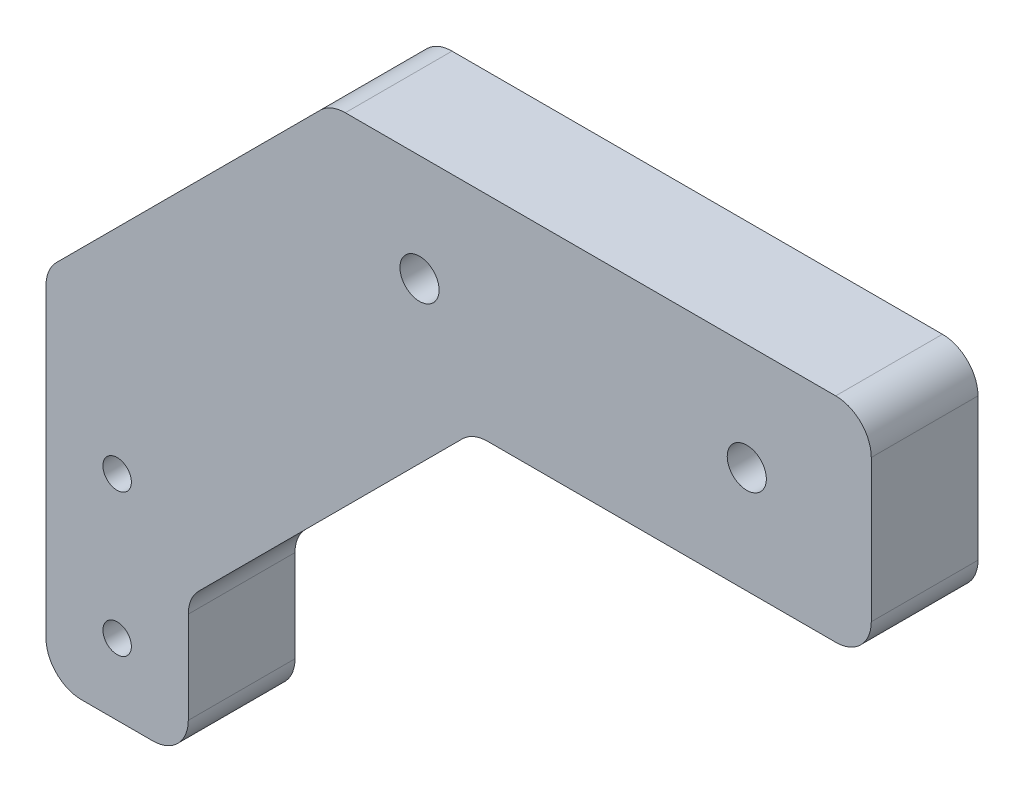
ISO-10303-21;
HEADER;
FILE_DESCRIPTION(('STEP AP214'),'2;1');
FILE_NAME('part.step','',(''),(''),'','','');
FILE_SCHEMA(('AUTOMOTIVE_DESIGN { 1 0 10303 214 1 1 1 1 }'));
ENDSEC;
DATA;
#1=APPLICATION_CONTEXT('core data for automotive mechanical design processes');
#2=APPLICATION_PROTOCOL_DEFINITION('international standard','automotive_design',2000,#1);
#3=PRODUCT_CONTEXT('',#1,'mechanical');
#4=PRODUCT('Part','Part','',(#3));
#5=PRODUCT_RELATED_PRODUCT_CATEGORY('part','',(#4));
#6=PRODUCT_DEFINITION_FORMATION('','',#4);
#7=PRODUCT_DEFINITION_CONTEXT('part definition',#1,'design');
#8=PRODUCT_DEFINITION('design','',#6,#7);
#9=PRODUCT_DEFINITION_SHAPE('','',#8);
#10=(LENGTH_UNIT() NAMED_UNIT(*) SI_UNIT(.MILLI.,.METRE.));
#11=(NAMED_UNIT(*) PLANE_ANGLE_UNIT() SI_UNIT($,.RADIAN.));
#12=(NAMED_UNIT(*) SI_UNIT($,.STERADIAN.) SOLID_ANGLE_UNIT());
#13=UNCERTAINTY_MEASURE_WITH_UNIT(LENGTH_MEASURE(1.E-05),#10,'distance_accuracy_value','');
#14=(GEOMETRIC_REPRESENTATION_CONTEXT(3) GLOBAL_UNCERTAINTY_ASSIGNED_CONTEXT((#13)) GLOBAL_UNIT_ASSIGNED_CONTEXT((#10,
#11,#12)) REPRESENTATION_CONTEXT('',''));
#15=CARTESIAN_POINT('',(0.,0.,0.));
#16=DIRECTION('',(0.,0.,1.));
#17=DIRECTION('',(1.,0.,0.));
#18=AXIS2_PLACEMENT_3D('',#15,#16,#17);
#19=CARTESIAN_POINT('',(20.,-60.,15.));
#20=DIRECTION('',(0.,1.,0.));
#21=DIRECTION('',(0.,0.,1.));
#22=AXIS2_PLACEMENT_3D('',#19,#20,#21);
#23=PLANE('',#22);
#24=DIRECTION('',(1.,0.,0.));
#25=VECTOR('',#24,1.);
#26=CARTESIAN_POINT('',(20.,-60.,15.));
#27=LINE('',#26,#25);
#28=CARTESIAN_POINT('',(5.,-60.,15.));
#29=VERTEX_POINT('',#28);
#30=CARTESIAN_POINT('',(15.,-60.,15.));
#31=VERTEX_POINT('',#30);
#32=EDGE_CURVE('E178',#29,#31,#27,.T.);
#33=ORIENTED_EDGE('',*,*,#32,.F.);
#34=DIRECTION('',(0.,0.,-1.));
#35=VECTOR('',#34,1.);
#36=CARTESIAN_POINT('',(5.,-60.,15.));
#37=LINE('',#36,#35);
#38=CARTESIAN_POINT('',(5.,-60.,0.));
#39=VERTEX_POINT('',#38);
#40=EDGE_CURVE('E224',#29,#39,#37,.T.);
#41=ORIENTED_EDGE('',*,*,#40,.T.);
#42=DIRECTION('',(1.,0.,0.));
#43=VECTOR('',#42,1.);
#44=CARTESIAN_POINT('',(20.,-60.,0.));
#45=LINE('',#44,#43);
#46=CARTESIAN_POINT('',(15.,-60.,0.));
#47=VERTEX_POINT('',#46);
#48=EDGE_CURVE('E282',#39,#47,#45,.T.);
#49=ORIENTED_EDGE('',*,*,#48,.T.);
#50=DIRECTION('',(0.,0.,-1.));
#51=VECTOR('',#50,1.);
#52=CARTESIAN_POINT('',(15.,-60.,15.));
#53=LINE('',#52,#51);
#54=EDGE_CURVE('E222',#47,#31,#53,.F.);
#55=ORIENTED_EDGE('',*,*,#54,.T.);
#56=EDGE_LOOP('',(#33,#41,#49,#55));
#57=FACE_BOUND('',#56,.T.);
#58=ADVANCED_FACE('F33',(#57),#23,.F.);
#59=CARTESIAN_POINT('',(20.,0.,15.));
#60=DIRECTION('',(-1.,0.,0.));
#61=DIRECTION('',(0.,-1.,0.));
#62=AXIS2_PLACEMENT_3D('',#59,#60,#61);
#63=PLANE('',#62);
#64=DIRECTION('',(0.,1.,0.));
#65=VECTOR('',#64,1.);
#66=CARTESIAN_POINT('',(20.,0.,15.));
#67=LINE('',#66,#65);
#68=CARTESIAN_POINT('',(20.,-55.,15.));
#69=VERTEX_POINT('',#68);
#70=CARTESIAN_POINT('',(20.,-42.0710678118653,15.));
#71=VERTEX_POINT('',#70);
#72=EDGE_CURVE('E271',#69,#71,#67,.T.);
#73=ORIENTED_EDGE('',*,*,#72,.F.);
#74=DIRECTION('',(0.,0.,-1.));
#75=VECTOR('',#74,1.);
#76=CARTESIAN_POINT('',(20.,-55.,15.));
#77=LINE('',#76,#75);
#78=CARTESIAN_POINT('',(20.,-55.,0.));
#79=VERTEX_POINT('',#78);
#80=EDGE_CURVE('E229',#69,#79,#77,.T.);
#81=ORIENTED_EDGE('',*,*,#80,.T.);
#82=DIRECTION('',(0.,1.,0.));
#83=VECTOR('',#82,1.);
#84=CARTESIAN_POINT('',(20.,0.,0.));
#85=LINE('',#84,#83);
#86=CARTESIAN_POINT('',(20.,-42.0710678118653,0.));
#87=VERTEX_POINT('',#86);
#88=EDGE_CURVE('E284',#79,#87,#85,.T.);
#89=ORIENTED_EDGE('',*,*,#88,.T.);
#90=DIRECTION('',(0.,0.,-1.));
#91=VECTOR('',#90,1.);
#92=CARTESIAN_POINT('',(20.,-42.0710678118653,15.));
#93=LINE('',#92,#91);
#94=EDGE_CURVE('E226',#87,#71,#93,.F.);
#95=ORIENTED_EDGE('',*,*,#94,.T.);
#96=EDGE_LOOP('',(#73,#81,#89,#95));
#97=FACE_BOUND('',#96,.T.);
#98=ADVANCED_FACE('F301',(#97),#63,.F.);
#99=CARTESIAN_POINT('',(116.,0.,15.));
#100=DIRECTION('',(0.,1.,0.));
#101=DIRECTION('',(-1.,0.,0.));
#102=AXIS2_PLACEMENT_3D('',#99,#100,#101);
#103=PLANE('',#102);
#104=DIRECTION('',(1.,0.,0.));
#105=VECTOR('',#104,1.);
#106=CARTESIAN_POINT('',(116.,0.,15.));
#107=LINE('',#106,#105);
#108=CARTESIAN_POINT('',(62.0710678118657,0.,15.));
#109=VERTEX_POINT('',#108);
#110=CARTESIAN_POINT('',(111.,0.,15.));
#111=VERTEX_POINT('',#110);
#112=EDGE_CURVE('E265',#109,#111,#107,.T.);
#113=ORIENTED_EDGE('',*,*,#112,.F.);
#114=DIRECTION('',(0.,0.,1.));
#115=VECTOR('',#114,1.);
#116=CARTESIAN_POINT('',(62.0710678118657,0.,0.));
#117=LINE('',#116,#115);
#118=CARTESIAN_POINT('',(62.0710678118657,0.,0.));
#119=VERTEX_POINT('',#118);
#120=EDGE_CURVE('E238',#109,#119,#117,.F.);
#121=ORIENTED_EDGE('',*,*,#120,.T.);
#122=DIRECTION('',(1.,0.,0.));
#123=VECTOR('',#122,1.);
#124=CARTESIAN_POINT('',(116.,0.,0.));
#125=LINE('',#124,#123);
#126=CARTESIAN_POINT('',(111.,0.,0.));
#127=VERTEX_POINT('',#126);
#128=EDGE_CURVE('E180',#119,#127,#125,.T.);
#129=ORIENTED_EDGE('',*,*,#128,.T.);
#130=DIRECTION('',(0.,0.,-1.));
#131=VECTOR('',#130,1.);
#132=CARTESIAN_POINT('',(111.,0.,15.));
#133=LINE('',#132,#131);
#134=EDGE_CURVE('E236',#127,#111,#133,.F.);
#135=ORIENTED_EDGE('',*,*,#134,.T.);
#136=EDGE_LOOP('',(#113,#121,#129,#135));
#137=FACE_BOUND('',#136,.T.);
#138=ADVANCED_FACE('F268',(#137),#103,.F.);
#139=CARTESIAN_POINT('',(116.,30.,15.));
#140=DIRECTION('',(-1.,0.,0.));
#141=DIRECTION('',(0.,0.,1.));
#142=AXIS2_PLACEMENT_3D('',#139,#140,#141);
#143=PLANE('',#142);
#144=DIRECTION('',(0.,1.,0.));
#145=VECTOR('',#144,1.);
#146=CARTESIAN_POINT('',(116.,30.,15.));
#147=LINE('',#146,#145);
#148=CARTESIAN_POINT('',(116.,5.,15.));
#149=VERTEX_POINT('',#148);
#150=CARTESIAN_POINT('',(116.,25.,15.));
#151=VERTEX_POINT('',#150);
#152=EDGE_CURVE('E270',#149,#151,#147,.T.);
#153=ORIENTED_EDGE('',*,*,#152,.F.);
#154=DIRECTION('',(0.,0.,-1.));
#155=VECTOR('',#154,1.);
#156=CARTESIAN_POINT('',(116.,5.,15.));
#157=LINE('',#156,#155);
#158=CARTESIAN_POINT('',(116.,5.,0.));
#159=VERTEX_POINT('',#158);
#160=EDGE_CURVE('E242',#149,#159,#157,.T.);
#161=ORIENTED_EDGE('',*,*,#160,.T.);
#162=DIRECTION('',(0.,1.,0.));
#163=VECTOR('',#162,1.);
#164=CARTESIAN_POINT('',(116.,30.,0.));
#165=LINE('',#164,#163);
#166=CARTESIAN_POINT('',(116.,25.,0.));
#167=VERTEX_POINT('',#166);
#168=EDGE_CURVE('E175',#159,#167,#165,.T.);
#169=ORIENTED_EDGE('',*,*,#168,.T.);
#170=DIRECTION('',(0.,0.,-1.));
#171=VECTOR('',#170,1.);
#172=CARTESIAN_POINT('',(116.,25.,15.));
#173=LINE('',#172,#171);
#174=EDGE_CURVE('E151',#167,#151,#173,.F.);
#175=ORIENTED_EDGE('',*,*,#174,.T.);
#176=EDGE_LOOP('',(#153,#161,#169,#175));
#177=FACE_BOUND('',#176,.T.);
#178=ADVANCED_FACE('F292',(#177),#143,.F.);
#179=CARTESIAN_POINT('',(0.,30.,15.));
#180=DIRECTION('',(0.,-1.,0.));
#181=DIRECTION('',(1.,0.,0.));
#182=AXIS2_PLACEMENT_3D('',#179,#180,#181);
#183=PLANE('',#182);
#184=DIRECTION('',(-1.,0.,0.));
#185=VECTOR('',#184,1.);
#186=CARTESIAN_POINT('',(0.,30.,0.));
#187=LINE('',#186,#185);
#188=CARTESIAN_POINT('',(111.,30.,0.));
#189=VERTEX_POINT('',#188);
#190=CARTESIAN_POINT('',(42.0710678118656,30.,0.));
#191=VERTEX_POINT('',#190);
#192=EDGE_CURVE('E163',#189,#191,#187,.T.);
#193=ORIENTED_EDGE('',*,*,#192,.T.);
#194=DIRECTION('',(0.,0.,-1.));
#195=VECTOR('',#194,1.);
#196=CARTESIAN_POINT('',(42.0710678118656,30.,15.));
#197=LINE('',#196,#195);
#198=CARTESIAN_POINT('',(42.0710678118656,30.,15.));
#199=VERTEX_POINT('',#198);
#200=EDGE_CURVE('E167',#191,#199,#197,.F.);
#201=ORIENTED_EDGE('',*,*,#200,.T.);
#202=DIRECTION('',(-1.,0.,0.));
#203=VECTOR('',#202,1.);
#204=CARTESIAN_POINT('',(0.,30.,15.));
#205=LINE('',#204,#203);
#206=CARTESIAN_POINT('',(111.,30.,15.));
#207=VERTEX_POINT('',#206);
#208=EDGE_CURVE('E166',#207,#199,#205,.T.);
#209=ORIENTED_EDGE('',*,*,#208,.F.);
#210=DIRECTION('',(0.,0.,-1.));
#211=VECTOR('',#210,1.);
#212=CARTESIAN_POINT('',(111.,30.,15.));
#213=LINE('',#212,#211);
#214=EDGE_CURVE('E150',#207,#189,#213,.T.);
#215=ORIENTED_EDGE('',*,*,#214,.T.);
#216=EDGE_LOOP('',(#193,#201,#209,#215));
#217=FACE_BOUND('',#216,.T.);
#218=ADVANCED_FACE('F161',(#217),#183,.F.);
#219=CARTESIAN_POINT('',(0.,-60.,15.));
#220=DIRECTION('',(1.,0.,0.));
#221=DIRECTION('',(0.,0.,-1.));
#222=AXIS2_PLACEMENT_3D('',#219,#220,#221);
#223=PLANE('',#222);
#224=DIRECTION('',(0.,-1.,0.));
#225=VECTOR('',#224,1.);
#226=CARTESIAN_POINT('',(0.,-60.,15.));
#227=LINE('',#226,#225);
#228=CARTESIAN_POINT('',(0.,-12.0710678118655,15.));
#229=VERTEX_POINT('',#228);
#230=CARTESIAN_POINT('',(0.,-55.,15.));
#231=VERTEX_POINT('',#230);
#232=EDGE_CURVE('E187',#229,#231,#227,.T.);
#233=ORIENTED_EDGE('',*,*,#232,.F.);
#234=DIRECTION('',(0.,0.,1.));
#235=VECTOR('',#234,1.);
#236=CARTESIAN_POINT('',(0.,-12.0710678118654,0.));
#237=LINE('',#236,#235);
#238=CARTESIAN_POINT('',(0.,-12.0710678118655,0.));
#239=VERTEX_POINT('',#238);
#240=EDGE_CURVE('E219',#229,#239,#237,.F.);
#241=ORIENTED_EDGE('',*,*,#240,.T.);
#242=DIRECTION('',(0.,-1.,0.));
#243=VECTOR('',#242,1.);
#244=CARTESIAN_POINT('',(0.,-60.,0.));
#245=LINE('',#244,#243);
#246=CARTESIAN_POINT('',(0.,-55.,0.));
#247=VERTEX_POINT('',#246);
#248=EDGE_CURVE('E174',#239,#247,#245,.T.);
#249=ORIENTED_EDGE('',*,*,#248,.T.);
#250=DIRECTION('',(0.,0.,-1.));
#251=VECTOR('',#250,1.);
#252=CARTESIAN_POINT('',(0.,-55.,15.));
#253=LINE('',#252,#251);
#254=EDGE_CURVE('E217',#247,#231,#253,.F.);
#255=ORIENTED_EDGE('',*,*,#254,.T.);
#256=EDGE_LOOP('',(#233,#241,#249,#255));
#257=FACE_BOUND('',#256,.T.);
#258=ADVANCED_FACE('F299',(#257),#223,.F.);
#259=CARTESIAN_POINT('',(0.,0.,15.));
#260=DIRECTION('',(0.,0.,-1.));
#261=DIRECTION('',(-1.,0.,0.));
#262=AXIS2_PLACEMENT_3D('',#259,#260,#261);
#263=PLANE('',#262);
#264=CARTESIAN_POINT('',(98.5,15.,15.));
#265=DIRECTION('',(0.,0.,-1.));
#266=DIRECTION('',(-1.,0.,0.));
#267=AXIS2_PLACEMENT_3D('',#264,#265,#266);
#268=CIRCLE('',#267,2.75000000000001);
#269=CARTESIAN_POINT('',(95.75,15.,15.));
#270=VERTEX_POINT('',#269);
#271=EDGE_CURVE('E532',#270,#270,#268,.T.);
#272=ORIENTED_EDGE('',*,*,#271,.T.);
#273=EDGE_LOOP('',(#272));
#274=FACE_BOUND('',#273,.T.);
#275=CARTESIAN_POINT('',(52.5,15.,15.));
#276=DIRECTION('',(0.,0.,-1.));
#277=DIRECTION('',(-1.,0.,0.));
#278=AXIS2_PLACEMENT_3D('',#275,#276,#277);
#279=CIRCLE('',#278,2.75);
#280=CARTESIAN_POINT('',(49.75,15.,15.));
#281=VERTEX_POINT('',#280);
#282=EDGE_CURVE('E526',#281,#281,#279,.T.);
#283=ORIENTED_EDGE('',*,*,#282,.T.);
#284=EDGE_LOOP('',(#283));
#285=FACE_BOUND('',#284,.T.);
#286=CARTESIAN_POINT('',(10.,-30.,15.));
#287=DIRECTION('',(0.,0.,-1.));
#288=DIRECTION('',(-1.,0.,0.));
#289=AXIS2_PLACEMENT_3D('',#286,#287,#288);
#290=CIRCLE('',#289,2.);
#291=CARTESIAN_POINT('',(8.,-30.,15.));
#292=VERTEX_POINT('',#291);
#293=EDGE_CURVE('E505',#292,#292,#290,.T.);
#294=ORIENTED_EDGE('',*,*,#293,.T.);
#295=EDGE_LOOP('',(#294));
#296=FACE_BOUND('',#295,.T.);
#297=CARTESIAN_POINT('',(10.,-50.,15.));
#298=DIRECTION('',(0.,0.,-1.));
#299=DIRECTION('',(-1.,0.,0.));
#300=AXIS2_PLACEMENT_3D('',#297,#298,#299);
#301=CIRCLE('',#300,2.);
#302=CARTESIAN_POINT('',(8.,-50.,15.));
#303=VERTEX_POINT('',#302);
#304=EDGE_CURVE('E499',#303,#303,#301,.T.);
#305=ORIENTED_EDGE('',*,*,#304,.T.);
#306=EDGE_LOOP('',(#305));
#307=FACE_BOUND('',#306,.T.);
#308=ORIENTED_EDGE('',*,*,#208,.T.);
#309=CARTESIAN_POINT('',(42.0710678118656,25.,15.));
#310=DIRECTION('',(0.,0.,-1.));
#311=DIRECTION('',(-1.,0.,0.));
#312=AXIS2_PLACEMENT_3D('',#309,#310,#311);
#313=CIRCLE('',#312,5.);
#314=CARTESIAN_POINT('',(38.5355339059328,28.5355339059327,15.));
#315=VERTEX_POINT('',#314);
#316=EDGE_CURVE('E206',#199,#315,#313,.F.);
#317=ORIENTED_EDGE('',*,*,#316,.T.);
#318=DIRECTION('',(0.707106781186549,0.707106781186546,0.));
#319=VECTOR('',#318,1.);
#320=CARTESIAN_POINT('',(0.,-9.99999999999997,15.));
#321=LINE('',#320,#319);
#322=CARTESIAN_POINT('',(1.46446609406727,-8.53553390593271,15.));
#323=VERTEX_POINT('',#322);
#324=EDGE_CURVE('E186',#315,#323,#321,.F.);
#325=ORIENTED_EDGE('',*,*,#324,.T.);
#326=CARTESIAN_POINT('',(5.,-12.0710678118654,15.));
#327=DIRECTION('',(0.,0.,-1.));
#328=DIRECTION('',(-1.,0.,0.));
#329=AXIS2_PLACEMENT_3D('',#326,#327,#328);
#330=CIRCLE('',#329,5.);
#331=EDGE_CURVE('E204',#323,#229,#330,.F.);
#332=ORIENTED_EDGE('',*,*,#331,.T.);
#333=ORIENTED_EDGE('',*,*,#232,.T.);
#334=CARTESIAN_POINT('',(5.,-55.,15.));
#335=DIRECTION('',(0.,0.,-1.));
#336=DIRECTION('',(-1.,0.,0.));
#337=AXIS2_PLACEMENT_3D('',#334,#335,#336);
#338=CIRCLE('',#337,5.);
#339=EDGE_CURVE('E202',#231,#29,#338,.F.);
#340=ORIENTED_EDGE('',*,*,#339,.T.);
#341=ORIENTED_EDGE('',*,*,#32,.T.);
#342=CARTESIAN_POINT('',(15.,-55.,15.));
#343=DIRECTION('',(0.,0.,-1.));
#344=DIRECTION('',(-1.,0.,0.));
#345=AXIS2_PLACEMENT_3D('',#342,#343,#344);
#346=CIRCLE('',#345,5.);
#347=EDGE_CURVE('E200',#31,#69,#346,.F.);
#348=ORIENTED_EDGE('',*,*,#347,.T.);
#349=ORIENTED_EDGE('',*,*,#72,.T.);
#350=CARTESIAN_POINT('',(25.,-42.0710678118653,15.));
#351=DIRECTION('',(0.,0.,-1.));
#352=DIRECTION('',(-1.,0.,0.));
#353=AXIS2_PLACEMENT_3D('',#350,#351,#352);
#354=CIRCLE('',#353,5.);
#355=CARTESIAN_POINT('',(21.4644660940673,-38.5355339059326,15.));
#356=VERTEX_POINT('',#355);
#357=EDGE_CURVE('E245',#71,#356,#354,.T.);
#358=ORIENTED_EDGE('',*,*,#357,.T.);
#359=DIRECTION('',(-0.707106781186551,-0.707106781186544,0.));
#360=VECTOR('',#359,1.);
#361=CARTESIAN_POINT('',(29.9999999999998,-30.0000000000001,15.));
#362=LINE('',#361,#360);
#363=CARTESIAN_POINT('',(58.535533905933,-1.46446609406724,15.));
#364=VERTEX_POINT('',#363);
#365=EDGE_CURVE('E168',#356,#364,#362,.F.);
#366=ORIENTED_EDGE('',*,*,#365,.T.);
#367=CARTESIAN_POINT('',(62.0710678118657,-5.,15.));
#368=DIRECTION('',(0.,0.,-1.));
#369=DIRECTION('',(-1.,0.,0.));
#370=AXIS2_PLACEMENT_3D('',#367,#368,#369);
#371=CIRCLE('',#370,5.);
#372=EDGE_CURVE('E11',#364,#109,#371,.T.);
#373=ORIENTED_EDGE('',*,*,#372,.T.);
#374=ORIENTED_EDGE('',*,*,#112,.T.);
#375=CARTESIAN_POINT('',(111.,5.,15.));
#376=DIRECTION('',(0.,0.,-1.));
#377=DIRECTION('',(-1.,0.,0.));
#378=AXIS2_PLACEMENT_3D('',#375,#376,#377);
#379=CIRCLE('',#378,5.);
#380=EDGE_CURVE('E198',#111,#149,#379,.F.);
#381=ORIENTED_EDGE('',*,*,#380,.T.);
#382=ORIENTED_EDGE('',*,*,#152,.T.);
#383=CARTESIAN_POINT('',(111.,25.,15.));
#384=DIRECTION('',(0.,0.,-1.));
#385=DIRECTION('',(-1.,0.,0.));
#386=AXIS2_PLACEMENT_3D('',#383,#384,#385);
#387=CIRCLE('',#386,5.);
#388=EDGE_CURVE('E196',#151,#207,#387,.F.);
#389=ORIENTED_EDGE('',*,*,#388,.T.);
#390=EDGE_LOOP('',(#308,#317,#325,#332,#333,#340,#341,#348,#349,#358,#366,#373,#374,#381,#382,#389));
#391=FACE_BOUND('',#390,.T.);
#392=ADVANCED_FACE('F264',(#274,#285,#296,#307,#391),#263,.F.);
#393=CARTESIAN_POINT('',(0.,0.,0.));
#394=DIRECTION('',(0.,0.,-1.));
#395=DIRECTION('',(-1.,0.,0.));
#396=AXIS2_PLACEMENT_3D('',#393,#394,#395);
#397=PLANE('',#396);
#398=CARTESIAN_POINT('',(98.5,15.,0.));
#399=DIRECTION('',(0.,0.,1.));
#400=DIRECTION('',(1.,0.,0.));
#401=AXIS2_PLACEMENT_3D('',#398,#399,#400);
#402=CIRCLE('',#401,2.75000000000001);
#403=CARTESIAN_POINT('',(95.75,15.,0.));
#404=VERTEX_POINT('',#403);
#405=EDGE_CURVE('E529',#404,#404,#402,.T.);
#406=ORIENTED_EDGE('',*,*,#405,.T.);
#407=EDGE_LOOP('',(#406));
#408=FACE_BOUND('',#407,.T.);
#409=CARTESIAN_POINT('',(52.5,15.,0.));
#410=DIRECTION('',(0.,0.,1.));
#411=DIRECTION('',(1.,0.,0.));
#412=AXIS2_PLACEMENT_3D('',#409,#410,#411);
#413=CIRCLE('',#412,2.75);
#414=CARTESIAN_POINT('',(49.75,15.,0.));
#415=VERTEX_POINT('',#414);
#416=EDGE_CURVE('E524',#415,#415,#413,.T.);
#417=ORIENTED_EDGE('',*,*,#416,.T.);
#418=EDGE_LOOP('',(#417));
#419=FACE_BOUND('',#418,.T.);
#420=CARTESIAN_POINT('',(10.,-30.,0.));
#421=DIRECTION('',(0.,0.,1.));
#422=DIRECTION('',(1.,0.,0.));
#423=AXIS2_PLACEMENT_3D('',#420,#421,#422);
#424=CIRCLE('',#423,2.);
#425=CARTESIAN_POINT('',(8.,-30.,0.));
#426=VERTEX_POINT('',#425);
#427=EDGE_CURVE('E501',#426,#426,#424,.T.);
#428=ORIENTED_EDGE('',*,*,#427,.T.);
#429=EDGE_LOOP('',(#428));
#430=FACE_BOUND('',#429,.T.);
#431=CARTESIAN_POINT('',(10.,-50.,0.));
#432=DIRECTION('',(0.,0.,1.));
#433=DIRECTION('',(1.,0.,0.));
#434=AXIS2_PLACEMENT_3D('',#431,#432,#433);
#435=CIRCLE('',#434,2.);
#436=CARTESIAN_POINT('',(8.,-50.,0.));
#437=VERTEX_POINT('',#436);
#438=EDGE_CURVE('E285',#437,#437,#435,.T.);
#439=ORIENTED_EDGE('',*,*,#438,.T.);
#440=EDGE_LOOP('',(#439));
#441=FACE_BOUND('',#440,.T.);
#442=DIRECTION('',(-0.707106781186549,-0.707106781186546,0.));
#443=VECTOR('',#442,1.);
#444=CARTESIAN_POINT('',(4.99999999999998,-5.,0.));
#445=LINE('',#444,#443);
#446=CARTESIAN_POINT('',(1.46446609406727,-8.53553390593271,0.));
#447=VERTEX_POINT('',#446);
#448=CARTESIAN_POINT('',(38.5355339059328,28.5355339059327,0.));
#449=VERTEX_POINT('',#448);
#450=EDGE_CURVE('E184',#447,#449,#445,.F.);
#451=ORIENTED_EDGE('',*,*,#450,.T.);
#452=CARTESIAN_POINT('',(42.0710678118656,25.,0.));
#453=DIRECTION('',(0.,0.,-1.));
#454=DIRECTION('',(-1.,0.,0.));
#455=AXIS2_PLACEMENT_3D('',#452,#453,#454);
#456=CIRCLE('',#455,5.);
#457=EDGE_CURVE('E173',#449,#191,#456,.T.);
#458=ORIENTED_EDGE('',*,*,#457,.T.);
#459=ORIENTED_EDGE('',*,*,#192,.F.);
#460=CARTESIAN_POINT('',(111.,25.,0.));
#461=DIRECTION('',(0.,0.,-1.));
#462=DIRECTION('',(-1.,0.,0.));
#463=AXIS2_PLACEMENT_3D('',#460,#461,#462);
#464=CIRCLE('',#463,5.);
#465=EDGE_CURVE('E147',#189,#167,#464,.T.);
#466=ORIENTED_EDGE('',*,*,#465,.T.);
#467=ORIENTED_EDGE('',*,*,#168,.F.);
#468=CARTESIAN_POINT('',(111.,5.,0.));
#469=DIRECTION('',(0.,0.,-1.));
#470=DIRECTION('',(-1.,0.,0.));
#471=AXIS2_PLACEMENT_3D('',#468,#469,#470);
#472=CIRCLE('',#471,5.);
#473=EDGE_CURVE('E155',#159,#127,#472,.T.);
#474=ORIENTED_EDGE('',*,*,#473,.T.);
#475=ORIENTED_EDGE('',*,*,#128,.F.);
#476=CARTESIAN_POINT('',(62.0710678118657,-5.,0.));
#477=DIRECTION('',(0.,0.,-1.));
#478=DIRECTION('',(-1.,0.,0.));
#479=AXIS2_PLACEMENT_3D('',#476,#477,#478);
#480=CIRCLE('',#479,5.);
#481=CARTESIAN_POINT('',(58.535533905933,-1.46446609406724,0.));
#482=VERTEX_POINT('',#481);
#483=EDGE_CURVE('E41',#119,#482,#480,.F.);
#484=ORIENTED_EDGE('',*,*,#483,.T.);
#485=DIRECTION('',(0.707106781186551,0.707106781186544,0.));
#486=VECTOR('',#485,1.);
#487=CARTESIAN_POINT('',(60.0000000000002,0.,0.));
#488=LINE('',#487,#486);
#489=CARTESIAN_POINT('',(21.4644660940673,-38.5355339059326,0.));
#490=VERTEX_POINT('',#489);
#491=EDGE_CURVE('E190',#482,#490,#488,.F.);
#492=ORIENTED_EDGE('',*,*,#491,.T.);
#493=CARTESIAN_POINT('',(25.,-42.0710678118653,0.));
#494=DIRECTION('',(0.,0.,-1.));
#495=DIRECTION('',(-1.,0.,0.));
#496=AXIS2_PLACEMENT_3D('',#493,#494,#495);
#497=CIRCLE('',#496,5.);
#498=EDGE_CURVE('E247',#490,#87,#497,.F.);
#499=ORIENTED_EDGE('',*,*,#498,.T.);
#500=ORIENTED_EDGE('',*,*,#88,.F.);
#501=CARTESIAN_POINT('',(15.,-55.,0.));
#502=DIRECTION('',(0.,0.,-1.));
#503=DIRECTION('',(-1.,0.,0.));
#504=AXIS2_PLACEMENT_3D('',#501,#502,#503);
#505=CIRCLE('',#504,5.);
#506=EDGE_CURVE('E48',#79,#47,#505,.T.);
#507=ORIENTED_EDGE('',*,*,#506,.T.);
#508=ORIENTED_EDGE('',*,*,#48,.F.);
#509=CARTESIAN_POINT('',(5.,-55.,0.));
#510=DIRECTION('',(0.,0.,-1.));
#511=DIRECTION('',(-1.,0.,0.));
#512=AXIS2_PLACEMENT_3D('',#509,#510,#511);
#513=CIRCLE('',#512,5.);
#514=EDGE_CURVE('E56',#39,#247,#513,.T.);
#515=ORIENTED_EDGE('',*,*,#514,.T.);
#516=ORIENTED_EDGE('',*,*,#248,.F.);
#517=CARTESIAN_POINT('',(5.,-12.0710678118654,0.));
#518=DIRECTION('',(0.,0.,-1.));
#519=DIRECTION('',(-1.,0.,0.));
#520=AXIS2_PLACEMENT_3D('',#517,#518,#519);
#521=CIRCLE('',#520,5.);
#522=EDGE_CURVE('E214',#239,#447,#521,.T.);
#523=ORIENTED_EDGE('',*,*,#522,.T.);
#524=EDGE_LOOP('',(#451,#458,#459,#466,#467,#474,#475,#484,#492,#499,#500,#507,#508,#515,#516,#523));
#525=FACE_BOUND('',#524,.T.);
#526=ADVANCED_FACE('F171',(#408,#419,#430,#441,#525),#397,.T.);
#527=CARTESIAN_POINT('',(10.,-50.,15.001));
#528=DIRECTION('',(0.,0.,-1.));
#529=DIRECTION('',(-1.,0.,0.));
#530=AXIS2_PLACEMENT_3D('',#527,#528,#529);
#531=CYLINDRICAL_SURFACE('',#530,2.);
#532=CARTESIAN_POINT('',(8.,-50.,0.));
#533=CARTESIAN_POINT('',(8.,-50.,0.15625));
#534=CARTESIAN_POINT('',(8.,-50.,0.3125));
#535=CARTESIAN_POINT('',(8.,-50.,0.625000000000001));
#536=CARTESIAN_POINT('',(8.,-50.,0.781250000000001));
#537=CARTESIAN_POINT('',(8.,-50.,1.09375));
#538=CARTESIAN_POINT('',(8.,-50.,1.25));
#539=CARTESIAN_POINT('',(8.,-50.,1.5625));
#540=CARTESIAN_POINT('',(8.,-50.,1.71875));
#541=CARTESIAN_POINT('',(8.,-50.,2.03125));
#542=CARTESIAN_POINT('',(8.,-50.,2.1875));
#543=CARTESIAN_POINT('',(8.,-50.,2.5));
#544=CARTESIAN_POINT('',(8.,-50.,2.65625));
#545=CARTESIAN_POINT('',(8.,-50.,2.96875));
#546=CARTESIAN_POINT('',(8.,-50.,3.125));
#547=CARTESIAN_POINT('',(8.,-50.,3.4375));
#548=CARTESIAN_POINT('',(8.,-50.,3.59375));
#549=CARTESIAN_POINT('',(8.,-50.,3.90625));
#550=CARTESIAN_POINT('',(8.,-50.,4.0625));
#551=CARTESIAN_POINT('',(8.,-50.,4.375));
#552=CARTESIAN_POINT('',(8.,-50.,4.53125));
#553=CARTESIAN_POINT('',(8.,-50.,4.84375));
#554=CARTESIAN_POINT('',(8.,-50.,5.));
#555=CARTESIAN_POINT('',(8.,-50.,5.3125));
#556=CARTESIAN_POINT('',(8.,-50.,5.46875));
#557=CARTESIAN_POINT('',(8.,-50.,5.78125));
#558=CARTESIAN_POINT('',(8.,-50.,5.9375));
#559=CARTESIAN_POINT('',(8.,-50.,6.25));
#560=CARTESIAN_POINT('',(8.,-50.,6.40625));
#561=CARTESIAN_POINT('',(8.,-50.,6.71875));
#562=CARTESIAN_POINT('',(8.,-50.,6.875));
#563=CARTESIAN_POINT('',(8.,-50.,7.1875));
#564=CARTESIAN_POINT('',(8.,-50.,7.34375));
#565=CARTESIAN_POINT('',(8.,-50.,7.65625));
#566=CARTESIAN_POINT('',(8.,-50.,7.8125));
#567=CARTESIAN_POINT('',(8.,-50.,8.125));
#568=CARTESIAN_POINT('',(8.,-50.,8.28125));
#569=CARTESIAN_POINT('',(8.,-50.,8.59375));
#570=CARTESIAN_POINT('',(8.,-50.,8.75));
#571=CARTESIAN_POINT('',(8.,-50.,9.0625));
#572=CARTESIAN_POINT('',(8.,-50.,9.21875));
#573=CARTESIAN_POINT('',(8.,-50.,9.53125));
#574=CARTESIAN_POINT('',(8.,-50.,9.6875));
#575=CARTESIAN_POINT('',(8.,-50.,10.));
#576=CARTESIAN_POINT('',(8.,-50.,10.15625));
#577=CARTESIAN_POINT('',(8.,-50.,10.46875));
#578=CARTESIAN_POINT('',(8.,-50.,10.625));
#579=CARTESIAN_POINT('',(8.,-50.,10.9375));
#580=CARTESIAN_POINT('',(8.,-50.,11.09375));
#581=CARTESIAN_POINT('',(8.,-50.,11.40625));
#582=CARTESIAN_POINT('',(8.,-50.,11.5625));
#583=CARTESIAN_POINT('',(8.,-50.,11.875));
#584=CARTESIAN_POINT('',(8.,-50.,12.03125));
#585=CARTESIAN_POINT('',(8.,-50.,12.34375));
#586=CARTESIAN_POINT('',(8.,-50.,12.5));
#587=CARTESIAN_POINT('',(8.,-50.,12.8125));
#588=CARTESIAN_POINT('',(8.,-50.,12.96875));
#589=CARTESIAN_POINT('',(8.,-50.,13.28125));
#590=CARTESIAN_POINT('',(8.,-50.,13.4375));
#591=CARTESIAN_POINT('',(8.,-50.,13.75));
#592=CARTESIAN_POINT('',(8.,-50.,13.90625));
#593=CARTESIAN_POINT('',(8.,-50.,14.21875));
#594=CARTESIAN_POINT('',(8.,-50.,14.375));
#595=CARTESIAN_POINT('',(8.,-50.,14.6875));
#596=CARTESIAN_POINT('',(8.,-50.,14.84375));
#597=CARTESIAN_POINT('',(8.,-50.,15.));
#598=B_SPLINE_CURVE_WITH_KNOTS('',3,(#532,#533,#534,#535,#536,#537,#538,#539,#540,#541,#542,
#543,#544,#545,#546,#547,#548,#549,#550,#551,#552,#553,#554,#555,#556,#557,#558,#559,#560,#561,
#562,#563,#564,#565,#566,#567,#568,#569,#570,#571,#572,#573,#574,#575,#576,#577,#578,#579,#580,
#581,#582,#583,#584,#585,#586,#587,#588,#589,#590,#591,#592,#593,#594,#595,#596,#597),
.UNSPECIFIED.,.F.,.F.,(4,2,2,2,2,2,2,2,2,2,2,2,2,2,2,2,2,2,2,2,2,2,2,2,2,2,2,2,2,2,2,2,4),(0.,
0.46875,0.937500000000001,1.40625,1.875,2.34375,2.8125,3.28125,3.75,4.21875,4.6875,5.15625,
5.625,6.09375,6.5625,7.03125,7.5,7.96875,8.4375,8.90625,9.375,9.84375,10.3125,10.78125,11.25,
11.71875,12.1875,12.65625,13.125,13.59375,14.0625,14.53125,15.),.UNSPECIFIED.);
#599=EDGE_CURVE('BSEAM409',#437,#303,#598,.T.);
#600=ORIENTED_EDGE('',*,*,#438,.F.);
#601=ORIENTED_EDGE('',*,*,#304,.F.);
#602=ORIENTED_EDGE('',*,*,#599,.T.);
#603=ORIENTED_EDGE('',*,*,#599,.F.);
#604=EDGE_LOOP('',(#600,#602,#601,#603));
#605=FACE_BOUND('',#604,.T.);
#606=ADVANCED_FACE('F409',(#605),#531,.F.);
#607=CARTESIAN_POINT('',(10.,-30.,15.001));
#608=DIRECTION('',(0.,0.,-1.));
#609=DIRECTION('',(-1.,0.,0.));
#610=AXIS2_PLACEMENT_3D('',#607,#608,#609);
#611=CYLINDRICAL_SURFACE('',#610,2.);
#612=CARTESIAN_POINT('',(8.,-30.,0.));
#613=CARTESIAN_POINT('',(8.,-30.,0.15625));
#614=CARTESIAN_POINT('',(8.,-30.,0.3125));
#615=CARTESIAN_POINT('',(8.,-30.,0.625000000000001));
#616=CARTESIAN_POINT('',(8.,-30.,0.781250000000001));
#617=CARTESIAN_POINT('',(8.,-30.,1.09375));
#618=CARTESIAN_POINT('',(8.,-30.,1.25));
#619=CARTESIAN_POINT('',(8.,-30.,1.5625));
#620=CARTESIAN_POINT('',(8.,-30.,1.71875));
#621=CARTESIAN_POINT('',(8.,-30.,2.03125));
#622=CARTESIAN_POINT('',(8.,-30.,2.1875));
#623=CARTESIAN_POINT('',(8.,-30.,2.5));
#624=CARTESIAN_POINT('',(8.,-30.,2.65625));
#625=CARTESIAN_POINT('',(8.,-30.,2.96875));
#626=CARTESIAN_POINT('',(8.,-30.,3.125));
#627=CARTESIAN_POINT('',(8.,-30.,3.4375));
#628=CARTESIAN_POINT('',(8.,-30.,3.59375));
#629=CARTESIAN_POINT('',(8.,-30.,3.90625));
#630=CARTESIAN_POINT('',(8.,-30.,4.0625));
#631=CARTESIAN_POINT('',(8.,-30.,4.375));
#632=CARTESIAN_POINT('',(8.,-30.,4.53125));
#633=CARTESIAN_POINT('',(8.,-30.,4.84375));
#634=CARTESIAN_POINT('',(8.,-30.,5.));
#635=CARTESIAN_POINT('',(8.,-30.,5.3125));
#636=CARTESIAN_POINT('',(8.,-30.,5.46875));
#637=CARTESIAN_POINT('',(8.,-30.,5.78125));
#638=CARTESIAN_POINT('',(8.,-30.,5.9375));
#639=CARTESIAN_POINT('',(8.,-30.,6.25));
#640=CARTESIAN_POINT('',(8.,-30.,6.40625));
#641=CARTESIAN_POINT('',(8.,-30.,6.71875));
#642=CARTESIAN_POINT('',(8.,-30.,6.875));
#643=CARTESIAN_POINT('',(8.,-30.,7.1875));
#644=CARTESIAN_POINT('',(8.,-30.,7.34375));
#645=CARTESIAN_POINT('',(8.,-30.,7.65625));
#646=CARTESIAN_POINT('',(8.,-30.,7.8125));
#647=CARTESIAN_POINT('',(8.,-30.,8.125));
#648=CARTESIAN_POINT('',(8.,-30.,8.28125));
#649=CARTESIAN_POINT('',(8.,-30.,8.59375));
#650=CARTESIAN_POINT('',(8.,-30.,8.75));
#651=CARTESIAN_POINT('',(8.,-30.,9.0625));
#652=CARTESIAN_POINT('',(8.,-30.,9.21875));
#653=CARTESIAN_POINT('',(8.,-30.,9.53125));
#654=CARTESIAN_POINT('',(8.,-30.,9.6875));
#655=CARTESIAN_POINT('',(8.,-30.,10.));
#656=CARTESIAN_POINT('',(8.,-30.,10.15625));
#657=CARTESIAN_POINT('',(8.,-30.,10.46875));
#658=CARTESIAN_POINT('',(8.,-30.,10.625));
#659=CARTESIAN_POINT('',(8.,-30.,10.9375));
#660=CARTESIAN_POINT('',(8.,-30.,11.09375));
#661=CARTESIAN_POINT('',(8.,-30.,11.40625));
#662=CARTESIAN_POINT('',(8.,-30.,11.5625));
#663=CARTESIAN_POINT('',(8.,-30.,11.875));
#664=CARTESIAN_POINT('',(8.,-30.,12.03125));
#665=CARTESIAN_POINT('',(8.,-30.,12.34375));
#666=CARTESIAN_POINT('',(8.,-30.,12.5));
#667=CARTESIAN_POINT('',(8.,-30.,12.8125));
#668=CARTESIAN_POINT('',(8.,-30.,12.96875));
#669=CARTESIAN_POINT('',(8.,-30.,13.28125));
#670=CARTESIAN_POINT('',(8.,-30.,13.4375));
#671=CARTESIAN_POINT('',(8.,-30.,13.75));
#672=CARTESIAN_POINT('',(8.,-30.,13.90625));
#673=CARTESIAN_POINT('',(8.,-30.,14.21875));
#674=CARTESIAN_POINT('',(8.,-30.,14.375));
#675=CARTESIAN_POINT('',(8.,-30.,14.6875));
#676=CARTESIAN_POINT('',(8.,-30.,14.84375));
#677=CARTESIAN_POINT('',(8.,-30.,15.));
#678=B_SPLINE_CURVE_WITH_KNOTS('',3,(#612,#613,#614,#615,#616,#617,#618,#619,#620,#621,#622,
#623,#624,#625,#626,#627,#628,#629,#630,#631,#632,#633,#634,#635,#636,#637,#638,#639,#640,#641,
#642,#643,#644,#645,#646,#647,#648,#649,#650,#651,#652,#653,#654,#655,#656,#657,#658,#659,#660,
#661,#662,#663,#664,#665,#666,#667,#668,#669,#670,#671,#672,#673,#674,#675,#676,#677),
.UNSPECIFIED.,.F.,.F.,(4,2,2,2,2,2,2,2,2,2,2,2,2,2,2,2,2,2,2,2,2,2,2,2,2,2,2,2,2,2,2,2,4),(0.,
0.46875,0.937500000000001,1.40625,1.875,2.34375,2.8125,3.28125,3.75,4.21875,4.6875,5.15625,
5.625,6.09375,6.5625,7.03125,7.5,7.96875,8.4375,8.90625,9.375,9.84375,10.3125,10.78125,11.25,
11.71875,12.1875,12.65625,13.125,13.59375,14.0625,14.53125,15.),.UNSPECIFIED.);
#679=EDGE_CURVE('BSEAM473',#426,#292,#678,.T.);
#680=ORIENTED_EDGE('',*,*,#427,.F.);
#681=ORIENTED_EDGE('',*,*,#293,.F.);
#682=ORIENTED_EDGE('',*,*,#679,.T.);
#683=ORIENTED_EDGE('',*,*,#679,.F.);
#684=EDGE_LOOP('',(#680,#682,#681,#683));
#685=FACE_BOUND('',#684,.T.);
#686=ADVANCED_FACE('F473',(#685),#611,.F.);
#687=CARTESIAN_POINT('',(52.5,15.,15.001));
#688=DIRECTION('',(0.,0.,-1.));
#689=DIRECTION('',(-1.,0.,0.));
#690=AXIS2_PLACEMENT_3D('',#687,#688,#689);
#691=CYLINDRICAL_SURFACE('',#690,2.75);
#692=CARTESIAN_POINT('',(49.75,15.,0.));
#693=CARTESIAN_POINT('',(49.75,15.,0.15625));
#694=CARTESIAN_POINT('',(49.75,15.,0.3125));
#695=CARTESIAN_POINT('',(49.75,15.,0.625000000000001));
#696=CARTESIAN_POINT('',(49.75,15.,0.781250000000001));
#697=CARTESIAN_POINT('',(49.75,15.,1.09375));
#698=CARTESIAN_POINT('',(49.75,15.,1.25));
#699=CARTESIAN_POINT('',(49.75,15.,1.5625));
#700=CARTESIAN_POINT('',(49.75,15.,1.71875));
#701=CARTESIAN_POINT('',(49.75,15.,2.03125));
#702=CARTESIAN_POINT('',(49.75,15.,2.1875));
#703=CARTESIAN_POINT('',(49.75,15.,2.5));
#704=CARTESIAN_POINT('',(49.75,15.,2.65625));
#705=CARTESIAN_POINT('',(49.75,15.,2.96875));
#706=CARTESIAN_POINT('',(49.75,15.,3.125));
#707=CARTESIAN_POINT('',(49.75,15.,3.4375));
#708=CARTESIAN_POINT('',(49.75,15.,3.59375));
#709=CARTESIAN_POINT('',(49.75,15.,3.90625));
#710=CARTESIAN_POINT('',(49.75,15.,4.0625));
#711=CARTESIAN_POINT('',(49.75,15.,4.375));
#712=CARTESIAN_POINT('',(49.75,15.,4.53125));
#713=CARTESIAN_POINT('',(49.75,15.,4.84375));
#714=CARTESIAN_POINT('',(49.75,15.,5.));
#715=CARTESIAN_POINT('',(49.75,15.,5.3125));
#716=CARTESIAN_POINT('',(49.75,15.,5.46875));
#717=CARTESIAN_POINT('',(49.75,15.,5.78125));
#718=CARTESIAN_POINT('',(49.75,15.,5.9375));
#719=CARTESIAN_POINT('',(49.75,15.,6.25));
#720=CARTESIAN_POINT('',(49.75,15.,6.40625));
#721=CARTESIAN_POINT('',(49.75,15.,6.71875));
#722=CARTESIAN_POINT('',(49.75,15.,6.875));
#723=CARTESIAN_POINT('',(49.75,15.,7.1875));
#724=CARTESIAN_POINT('',(49.75,15.,7.34375));
#725=CARTESIAN_POINT('',(49.75,15.,7.65625));
#726=CARTESIAN_POINT('',(49.75,15.,7.8125));
#727=CARTESIAN_POINT('',(49.75,15.,8.125));
#728=CARTESIAN_POINT('',(49.75,15.,8.28125));
#729=CARTESIAN_POINT('',(49.75,15.,8.59375));
#730=CARTESIAN_POINT('',(49.75,15.,8.75));
#731=CARTESIAN_POINT('',(49.75,15.,9.0625));
#732=CARTESIAN_POINT('',(49.75,15.,9.21875));
#733=CARTESIAN_POINT('',(49.75,15.,9.53125));
#734=CARTESIAN_POINT('',(49.75,15.,9.6875));
#735=CARTESIAN_POINT('',(49.75,15.,10.));
#736=CARTESIAN_POINT('',(49.75,15.,10.15625));
#737=CARTESIAN_POINT('',(49.75,15.,10.46875));
#738=CARTESIAN_POINT('',(49.75,15.,10.625));
#739=CARTESIAN_POINT('',(49.75,15.,10.9375));
#740=CARTESIAN_POINT('',(49.75,15.,11.09375));
#741=CARTESIAN_POINT('',(49.75,15.,11.40625));
#742=CARTESIAN_POINT('',(49.75,15.,11.5625));
#743=CARTESIAN_POINT('',(49.75,15.,11.875));
#744=CARTESIAN_POINT('',(49.75,15.,12.03125));
#745=CARTESIAN_POINT('',(49.75,15.,12.34375));
#746=CARTESIAN_POINT('',(49.75,15.,12.5));
#747=CARTESIAN_POINT('',(49.75,15.,12.8125));
#748=CARTESIAN_POINT('',(49.75,15.,12.96875));
#749=CARTESIAN_POINT('',(49.75,15.,13.28125));
#750=CARTESIAN_POINT('',(49.75,15.,13.4375));
#751=CARTESIAN_POINT('',(49.75,15.,13.75));
#752=CARTESIAN_POINT('',(49.75,15.,13.90625));
#753=CARTESIAN_POINT('',(49.75,15.,14.21875));
#754=CARTESIAN_POINT('',(49.75,15.,14.375));
#755=CARTESIAN_POINT('',(49.75,15.,14.6875));
#756=CARTESIAN_POINT('',(49.75,15.,14.84375));
#757=CARTESIAN_POINT('',(49.75,15.,15.));
#758=B_SPLINE_CURVE_WITH_KNOTS('',3,(#692,#693,#694,#695,#696,#697,#698,#699,#700,#701,#702,
#703,#704,#705,#706,#707,#708,#709,#710,#711,#712,#713,#714,#715,#716,#717,#718,#719,#720,#721,
#722,#723,#724,#725,#726,#727,#728,#729,#730,#731,#732,#733,#734,#735,#736,#737,#738,#739,#740,
#741,#742,#743,#744,#745,#746,#747,#748,#749,#750,#751,#752,#753,#754,#755,#756,#757),
.UNSPECIFIED.,.F.,.F.,(4,2,2,2,2,2,2,2,2,2,2,2,2,2,2,2,2,2,2,2,2,2,2,2,2,2,2,2,2,2,2,2,4),(0.,
0.46875,0.937500000000001,1.40625,1.875,2.34375,2.8125,3.28125,3.75,4.21875,4.6875,5.15625,
5.625,6.09375,6.5625,7.03125,7.5,7.96875,8.4375,8.90625,9.375,9.84375,10.3125,10.78125,11.25,
11.71875,12.1875,12.65625,13.125,13.59375,14.0625,14.53125,15.),.UNSPECIFIED.);
#759=EDGE_CURVE('BSEAM463',#415,#281,#758,.T.);
#760=ORIENTED_EDGE('',*,*,#416,.F.);
#761=ORIENTED_EDGE('',*,*,#282,.F.);
#762=ORIENTED_EDGE('',*,*,#759,.T.);
#763=ORIENTED_EDGE('',*,*,#759,.F.);
#764=EDGE_LOOP('',(#760,#762,#761,#763));
#765=FACE_BOUND('',#764,.T.);
#766=ADVANCED_FACE('F463',(#765),#691,.F.);
#767=CARTESIAN_POINT('',(98.5,15.,15.001));
#768=DIRECTION('',(0.,0.,-1.));
#769=DIRECTION('',(-1.,0.,0.));
#770=AXIS2_PLACEMENT_3D('',#767,#768,#769);
#771=CYLINDRICAL_SURFACE('',#770,2.75000000000001);
#772=CARTESIAN_POINT('',(95.75,15.,0.));
#773=CARTESIAN_POINT('',(95.75,15.,0.15625));
#774=CARTESIAN_POINT('',(95.75,15.,0.3125));
#775=CARTESIAN_POINT('',(95.75,15.,0.625000000000001));
#776=CARTESIAN_POINT('',(95.75,15.,0.781250000000001));
#777=CARTESIAN_POINT('',(95.75,15.,1.09375));
#778=CARTESIAN_POINT('',(95.75,15.,1.25));
#779=CARTESIAN_POINT('',(95.75,15.,1.5625));
#780=CARTESIAN_POINT('',(95.75,15.,1.71875));
#781=CARTESIAN_POINT('',(95.75,15.,2.03125));
#782=CARTESIAN_POINT('',(95.75,15.,2.1875));
#783=CARTESIAN_POINT('',(95.75,15.,2.5));
#784=CARTESIAN_POINT('',(95.75,15.,2.65625));
#785=CARTESIAN_POINT('',(95.75,15.,2.96875));
#786=CARTESIAN_POINT('',(95.75,15.,3.125));
#787=CARTESIAN_POINT('',(95.75,15.,3.4375));
#788=CARTESIAN_POINT('',(95.75,15.,3.59375));
#789=CARTESIAN_POINT('',(95.75,15.,3.90625));
#790=CARTESIAN_POINT('',(95.75,15.,4.0625));
#791=CARTESIAN_POINT('',(95.75,15.,4.375));
#792=CARTESIAN_POINT('',(95.75,15.,4.53125));
#793=CARTESIAN_POINT('',(95.75,15.,4.84375));
#794=CARTESIAN_POINT('',(95.75,15.,5.));
#795=CARTESIAN_POINT('',(95.75,15.,5.3125));
#796=CARTESIAN_POINT('',(95.75,15.,5.46875));
#797=CARTESIAN_POINT('',(95.75,15.,5.78125));
#798=CARTESIAN_POINT('',(95.75,15.,5.9375));
#799=CARTESIAN_POINT('',(95.75,15.,6.25));
#800=CARTESIAN_POINT('',(95.75,15.,6.40625));
#801=CARTESIAN_POINT('',(95.75,15.,6.71875));
#802=CARTESIAN_POINT('',(95.75,15.,6.875));
#803=CARTESIAN_POINT('',(95.75,15.,7.1875));
#804=CARTESIAN_POINT('',(95.75,15.,7.34375));
#805=CARTESIAN_POINT('',(95.75,15.,7.65625));
#806=CARTESIAN_POINT('',(95.75,15.,7.8125));
#807=CARTESIAN_POINT('',(95.75,15.,8.125));
#808=CARTESIAN_POINT('',(95.75,15.,8.28125));
#809=CARTESIAN_POINT('',(95.75,15.,8.59375));
#810=CARTESIAN_POINT('',(95.75,15.,8.75));
#811=CARTESIAN_POINT('',(95.75,15.,9.0625));
#812=CARTESIAN_POINT('',(95.75,15.,9.21875));
#813=CARTESIAN_POINT('',(95.75,15.,9.53125));
#814=CARTESIAN_POINT('',(95.75,15.,9.6875));
#815=CARTESIAN_POINT('',(95.75,15.,10.));
#816=CARTESIAN_POINT('',(95.75,15.,10.15625));
#817=CARTESIAN_POINT('',(95.75,15.,10.46875));
#818=CARTESIAN_POINT('',(95.75,15.,10.625));
#819=CARTESIAN_POINT('',(95.75,15.,10.9375));
#820=CARTESIAN_POINT('',(95.75,15.,11.09375));
#821=CARTESIAN_POINT('',(95.75,15.,11.40625));
#822=CARTESIAN_POINT('',(95.75,15.,11.5625));
#823=CARTESIAN_POINT('',(95.75,15.,11.875));
#824=CARTESIAN_POINT('',(95.75,15.,12.03125));
#825=CARTESIAN_POINT('',(95.75,15.,12.34375));
#826=CARTESIAN_POINT('',(95.75,15.,12.5));
#827=CARTESIAN_POINT('',(95.75,15.,12.8125));
#828=CARTESIAN_POINT('',(95.75,15.,12.96875));
#829=CARTESIAN_POINT('',(95.75,15.,13.28125));
#830=CARTESIAN_POINT('',(95.75,15.,13.4375));
#831=CARTESIAN_POINT('',(95.75,15.,13.75));
#832=CARTESIAN_POINT('',(95.75,15.,13.90625));
#833=CARTESIAN_POINT('',(95.75,15.,14.21875));
#834=CARTESIAN_POINT('',(95.75,15.,14.375));
#835=CARTESIAN_POINT('',(95.75,15.,14.6875));
#836=CARTESIAN_POINT('',(95.75,15.,14.84375));
#837=CARTESIAN_POINT('',(95.75,15.,15.));
#838=B_SPLINE_CURVE_WITH_KNOTS('',3,(#772,#773,#774,#775,#776,#777,#778,#779,#780,#781,#782,
#783,#784,#785,#786,#787,#788,#789,#790,#791,#792,#793,#794,#795,#796,#797,#798,#799,#800,#801,
#802,#803,#804,#805,#806,#807,#808,#809,#810,#811,#812,#813,#814,#815,#816,#817,#818,#819,#820,
#821,#822,#823,#824,#825,#826,#827,#828,#829,#830,#831,#832,#833,#834,#835,#836,#837),
.UNSPECIFIED.,.F.,.F.,(4,2,2,2,2,2,2,2,2,2,2,2,2,2,2,2,2,2,2,2,2,2,2,2,2,2,2,2,2,2,2,2,4),(0.,
0.46875,0.937500000000001,1.40625,1.875,2.34375,2.8125,3.28125,3.75,4.21875,4.6875,5.15625,
5.625,6.09375,6.5625,7.03125,7.5,7.96875,8.4375,8.90625,9.375,9.84375,10.3125,10.78125,11.25,
11.71875,12.1875,12.65625,13.125,13.59375,14.0625,14.53125,15.),.UNSPECIFIED.);
#839=EDGE_CURVE('BSEAM316',#404,#270,#838,.T.);
#840=ORIENTED_EDGE('',*,*,#405,.F.);
#841=ORIENTED_EDGE('',*,*,#271,.F.);
#842=ORIENTED_EDGE('',*,*,#839,.T.);
#843=ORIENTED_EDGE('',*,*,#839,.F.);
#844=EDGE_LOOP('',(#840,#842,#841,#843));
#845=FACE_BOUND('',#844,.T.);
#846=ADVANCED_FACE('F316',(#845),#771,.F.);
#847=CARTESIAN_POINT('',(0.,-9.99999999999997,15.));
#848=DIRECTION('',(0.707106781186546,-0.707106781186549,0.));
#849=DIRECTION('',(0.,0.,-1.));
#850=AXIS2_PLACEMENT_3D('',#847,#848,#849);
#851=PLANE('',#850);
#852=ORIENTED_EDGE('',*,*,#324,.F.);
#853=DIRECTION('',(0.,0.,1.));
#854=VECTOR('',#853,1.);
#855=CARTESIAN_POINT('',(38.5355339059328,28.5355339059327,0.));
#856=LINE('',#855,#854);
#857=EDGE_CURVE('E156',#315,#449,#856,.F.);
#858=ORIENTED_EDGE('',*,*,#857,.T.);
#859=ORIENTED_EDGE('',*,*,#450,.F.);
#860=DIRECTION('',(0.,0.,-1.));
#861=VECTOR('',#860,1.);
#862=CARTESIAN_POINT('',(1.46446609406727,-8.53553390593271,15.));
#863=LINE('',#862,#861);
#864=EDGE_CURVE('E208',#447,#323,#863,.F.);
#865=ORIENTED_EDGE('',*,*,#864,.T.);
#866=EDGE_LOOP('',(#852,#858,#859,#865));
#867=FACE_BOUND('',#866,.T.);
#868=ADVANCED_FACE('F313',(#867),#851,.F.);
#869=CARTESIAN_POINT('',(60.0000000000002,0.,15.));
#870=DIRECTION('',(0.707106781186544,-0.707106781186551,0.));
#871=DIRECTION('',(0.,0.,1.));
#872=AXIS2_PLACEMENT_3D('',#869,#870,#871);
#873=PLANE('',#872);
#874=ORIENTED_EDGE('',*,*,#365,.F.);
#875=DIRECTION('',(0.,0.,1.));
#876=VECTOR('',#875,1.);
#877=CARTESIAN_POINT('',(21.4644660940673,-38.5355339059326,0.));
#878=LINE('',#877,#876);
#879=EDGE_CURVE('E234',#356,#490,#878,.F.);
#880=ORIENTED_EDGE('',*,*,#879,.T.);
#881=ORIENTED_EDGE('',*,*,#491,.F.);
#882=DIRECTION('',(0.,0.,-1.));
#883=VECTOR('',#882,1.);
#884=CARTESIAN_POINT('',(58.535533905933,-1.46446609406724,15.));
#885=LINE('',#884,#883);
#886=EDGE_CURVE('E232',#482,#364,#885,.F.);
#887=ORIENTED_EDGE('',*,*,#886,.T.);
#888=EDGE_LOOP('',(#874,#880,#881,#887));
#889=FACE_BOUND('',#888,.T.);
#890=ADVANCED_FACE('F257',(#889),#873,.T.);
#891=CARTESIAN_POINT('',(42.0710678118656,25.,15.));
#892=DIRECTION('',(0.,0.,1.));
#893=DIRECTION('',(1.,0.,0.));
#894=AXIS2_PLACEMENT_3D('',#891,#892,#893);
#895=CYLINDRICAL_SURFACE('',#894,5.);
#896=ORIENTED_EDGE('',*,*,#457,.F.);
#897=ORIENTED_EDGE('',*,*,#857,.F.);
#898=ORIENTED_EDGE('',*,*,#316,.F.);
#899=ORIENTED_EDGE('',*,*,#200,.F.);
#900=EDGE_LOOP('',(#896,#897,#898,#899));
#901=FACE_BOUND('',#900,.T.);
#902=ADVANCED_FACE('F320',(#901),#895,.T.);
#903=CARTESIAN_POINT('',(5.,-12.0710678118654,15.));
#904=DIRECTION('',(0.,0.,-1.));
#905=DIRECTION('',(-1.,0.,0.));
#906=AXIS2_PLACEMENT_3D('',#903,#904,#905);
#907=CYLINDRICAL_SURFACE('',#906,5.);
#908=ORIENTED_EDGE('',*,*,#331,.F.);
#909=ORIENTED_EDGE('',*,*,#864,.F.);
#910=ORIENTED_EDGE('',*,*,#522,.F.);
#911=ORIENTED_EDGE('',*,*,#240,.F.);
#912=EDGE_LOOP('',(#908,#909,#910,#911));
#913=FACE_BOUND('',#912,.T.);
#914=ADVANCED_FACE('F323',(#913),#907,.T.);
#915=CARTESIAN_POINT('',(5.,-55.,15.));
#916=DIRECTION('',(0.,0.,-1.));
#917=DIRECTION('',(-1.,0.,0.));
#918=AXIS2_PLACEMENT_3D('',#915,#916,#917);
#919=CYLINDRICAL_SURFACE('',#918,5.);
#920=ORIENTED_EDGE('',*,*,#339,.F.);
#921=ORIENTED_EDGE('',*,*,#254,.F.);
#922=ORIENTED_EDGE('',*,*,#514,.F.);
#923=ORIENTED_EDGE('',*,*,#40,.F.);
#924=EDGE_LOOP('',(#920,#921,#922,#923));
#925=FACE_BOUND('',#924,.T.);
#926=ADVANCED_FACE('F327',(#925),#919,.T.);
#927=CARTESIAN_POINT('',(15.,-55.,15.));
#928=DIRECTION('',(0.,0.,-1.));
#929=DIRECTION('',(-1.,0.,0.));
#930=AXIS2_PLACEMENT_3D('',#927,#928,#929);
#931=CYLINDRICAL_SURFACE('',#930,5.);
#932=ORIENTED_EDGE('',*,*,#347,.F.);
#933=ORIENTED_EDGE('',*,*,#54,.F.);
#934=ORIENTED_EDGE('',*,*,#506,.F.);
#935=ORIENTED_EDGE('',*,*,#80,.F.);
#936=EDGE_LOOP('',(#932,#933,#934,#935));
#937=FACE_BOUND('',#936,.T.);
#938=ADVANCED_FACE('F331',(#937),#931,.T.);
#939=CARTESIAN_POINT('',(25.,-42.0710678118653,15.));
#940=DIRECTION('',(0.,0.,1.));
#941=DIRECTION('',(1.,0.,0.));
#942=AXIS2_PLACEMENT_3D('',#939,#940,#941);
#943=CYLINDRICAL_SURFACE('',#942,5.);
#944=ORIENTED_EDGE('',*,*,#498,.F.);
#945=ORIENTED_EDGE('',*,*,#879,.F.);
#946=ORIENTED_EDGE('',*,*,#357,.F.);
#947=ORIENTED_EDGE('',*,*,#94,.F.);
#948=EDGE_LOOP('',(#944,#945,#946,#947));
#949=FACE_BOUND('',#948,.T.);
#950=ADVANCED_FACE('F334',(#949),#943,.F.);
#951=CARTESIAN_POINT('',(62.0710678118657,-5.,15.));
#952=DIRECTION('',(0.,0.,-1.));
#953=DIRECTION('',(-1.,0.,0.));
#954=AXIS2_PLACEMENT_3D('',#951,#952,#953);
#955=CYLINDRICAL_SURFACE('',#954,5.);
#956=ORIENTED_EDGE('',*,*,#372,.F.);
#957=ORIENTED_EDGE('',*,*,#886,.F.);
#958=ORIENTED_EDGE('',*,*,#483,.F.);
#959=ORIENTED_EDGE('',*,*,#120,.F.);
#960=EDGE_LOOP('',(#956,#957,#958,#959));
#961=FACE_BOUND('',#960,.T.);
#962=ADVANCED_FACE('F260',(#961),#955,.F.);
#963=CARTESIAN_POINT('',(111.,5.,15.));
#964=DIRECTION('',(0.,0.,-1.));
#965=DIRECTION('',(-1.,0.,0.));
#966=AXIS2_PLACEMENT_3D('',#963,#964,#965);
#967=CYLINDRICAL_SURFACE('',#966,5.);
#968=ORIENTED_EDGE('',*,*,#380,.F.);
#969=ORIENTED_EDGE('',*,*,#134,.F.);
#970=ORIENTED_EDGE('',*,*,#473,.F.);
#971=ORIENTED_EDGE('',*,*,#160,.F.);
#972=EDGE_LOOP('',(#968,#969,#970,#971));
#973=FACE_BOUND('',#972,.T.);
#974=ADVANCED_FACE('F288',(#973),#967,.T.);
#975=CARTESIAN_POINT('',(111.,25.,15.));
#976=DIRECTION('',(0.,0.,-1.));
#977=DIRECTION('',(-1.,0.,0.));
#978=AXIS2_PLACEMENT_3D('',#975,#976,#977);
#979=CYLINDRICAL_SURFACE('',#978,5.);
#980=ORIENTED_EDGE('',*,*,#388,.F.);
#981=ORIENTED_EDGE('',*,*,#174,.F.);
#982=ORIENTED_EDGE('',*,*,#465,.F.);
#983=ORIENTED_EDGE('',*,*,#214,.F.);
#984=EDGE_LOOP('',(#980,#981,#982,#983));
#985=FACE_BOUND('',#984,.T.);
#986=ADVANCED_FACE('F35',(#985),#979,.T.);
#987=CLOSED_SHELL('',(#58,#98,#138,#178,#218,#258,#392,#526,#606,#686,#766,#846,#868,#890,#902,
#914,#926,#938,#950,#962,#974,#986));
#988=MANIFOLD_SOLID_BREP('B2',#987);
#989=ADVANCED_BREP_SHAPE_REPRESENTATION('',(#18,#988),#14);
#990=SHAPE_DEFINITION_REPRESENTATION(#9,#989);
ENDSEC;
END-ISO-10303-21;
